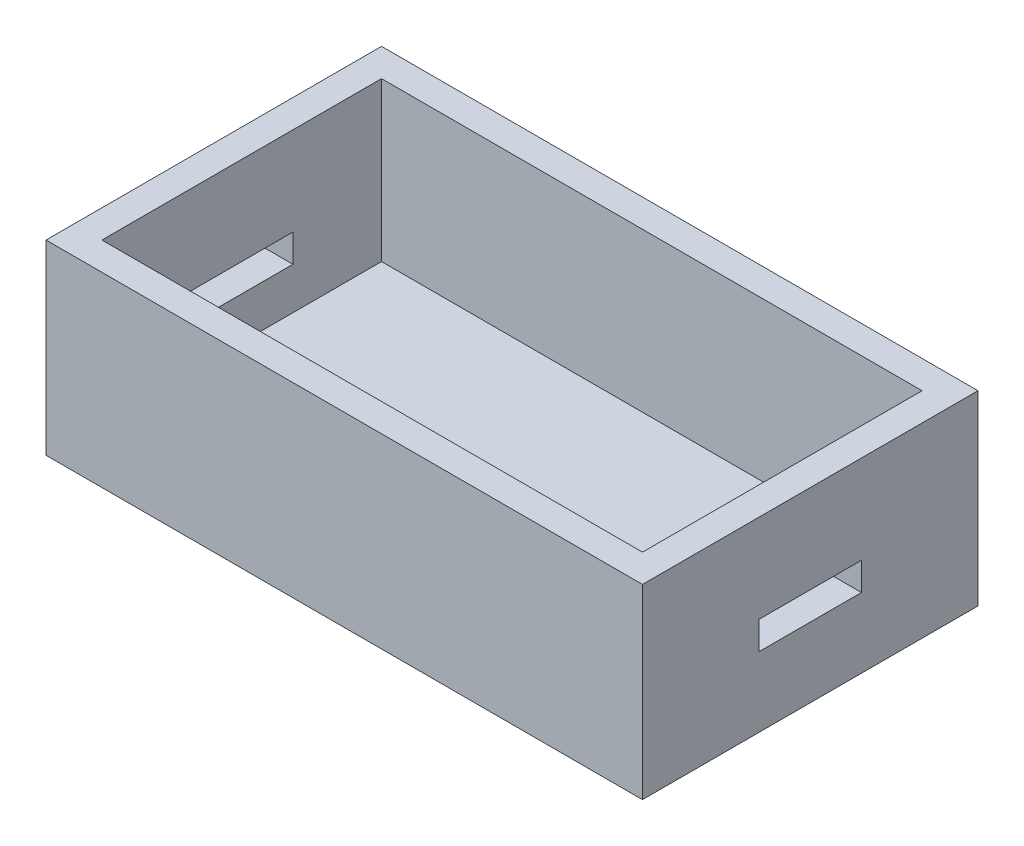
ISO-10303-21;
HEADER;
FILE_DESCRIPTION(('STEP AP214'),'2;1');
FILE_NAME('part.step','',(''),(''),'','','');
FILE_SCHEMA(('AUTOMOTIVE_DESIGN { 1 0 10303 214 1 1 1 1 }'));
ENDSEC;
DATA;
#1=APPLICATION_CONTEXT('core data for automotive mechanical design processes');
#2=APPLICATION_PROTOCOL_DEFINITION('international standard','automotive_design',2000,#1);
#3=PRODUCT_CONTEXT('',#1,'mechanical');
#4=PRODUCT('Part','Part','',(#3));
#5=PRODUCT_RELATED_PRODUCT_CATEGORY('part','',(#4));
#6=PRODUCT_DEFINITION_FORMATION('','',#4);
#7=PRODUCT_DEFINITION_CONTEXT('part definition',#1,'design');
#8=PRODUCT_DEFINITION('design','',#6,#7);
#9=PRODUCT_DEFINITION_SHAPE('','',#8);
#10=(LENGTH_UNIT() NAMED_UNIT(*) SI_UNIT(.MILLI.,.METRE.));
#11=(NAMED_UNIT(*) PLANE_ANGLE_UNIT() SI_UNIT($,.RADIAN.));
#12=(NAMED_UNIT(*) SI_UNIT($,.STERADIAN.) SOLID_ANGLE_UNIT());
#13=UNCERTAINTY_MEASURE_WITH_UNIT(LENGTH_MEASURE(1.E-05),#10,'distance_accuracy_value','');
#14=(GEOMETRIC_REPRESENTATION_CONTEXT(3) GLOBAL_UNCERTAINTY_ASSIGNED_CONTEXT((#13)) GLOBAL_UNIT_ASSIGNED_CONTEXT((#10,
#11,#12)) REPRESENTATION_CONTEXT('',''));
#15=CARTESIAN_POINT('',(0.,0.,0.));
#16=DIRECTION('',(0.,0.,1.));
#17=DIRECTION('',(1.,0.,0.));
#18=AXIS2_PLACEMENT_3D('',#15,#16,#17);
#19=CARTESIAN_POINT('',(0.,10.,0.));
#20=DIRECTION('',(0.,-1.,0.));
#21=DIRECTION('',(0.,0.,-1.));
#22=AXIS2_PLACEMENT_3D('',#19,#20,#21);
#23=PLANE('',#22);
#24=DIRECTION('',(0.,0.,-1.));
#25=VECTOR('',#24,1.);
#26=CARTESIAN_POINT('',(16.,10.,9.));
#27=LINE('',#26,#25);
#28=CARTESIAN_POINT('',(16.,10.,9.));
#29=VERTEX_POINT('',#28);
#30=CARTESIAN_POINT('',(16.,10.,-9.));
#31=VERTEX_POINT('',#30);
#32=EDGE_CURVE('E271',#29,#31,#27,.T.);
#33=ORIENTED_EDGE('',*,*,#32,.T.);
#34=DIRECTION('',(-1.,0.,0.));
#35=VECTOR('',#34,1.);
#36=CARTESIAN_POINT('',(-16.,10.,-9.));
#37=LINE('',#36,#35);
#38=CARTESIAN_POINT('',(-16.,10.,-9.));
#39=VERTEX_POINT('',#38);
#40=EDGE_CURVE('E276',#31,#39,#37,.T.);
#41=ORIENTED_EDGE('',*,*,#40,.T.);
#42=DIRECTION('',(0.,0.,1.));
#43=VECTOR('',#42,1.);
#44=CARTESIAN_POINT('',(-16.,10.,9.));
#45=LINE('',#44,#43);
#46=CARTESIAN_POINT('',(-16.,10.,9.));
#47=VERTEX_POINT('',#46);
#48=EDGE_CURVE('E281',#39,#47,#45,.T.);
#49=ORIENTED_EDGE('',*,*,#48,.T.);
#50=DIRECTION('',(1.,0.,0.));
#51=VECTOR('',#50,1.);
#52=CARTESIAN_POINT('',(-16.,10.,9.));
#53=LINE('',#52,#51);
#54=EDGE_CURVE('E282',#47,#29,#53,.T.);
#55=ORIENTED_EDGE('',*,*,#54,.T.);
#56=EDGE_LOOP('',(#33,#41,#49,#55));
#57=FACE_BOUND('',#56,.T.);
#58=DIRECTION('',(0.,0.,-1.));
#59=VECTOR('',#58,1.);
#60=CARTESIAN_POINT('',(14.5,10.,0.));
#61=LINE('',#60,#59);
#62=CARTESIAN_POINT('',(14.5,10.,7.5));
#63=VERTEX_POINT('',#62);
#64=CARTESIAN_POINT('',(14.5,10.,-7.5));
#65=VERTEX_POINT('',#64);
#66=EDGE_CURVE('E261',#63,#65,#61,.T.);
#67=ORIENTED_EDGE('',*,*,#66,.F.);
#68=DIRECTION('',(1.,0.,0.));
#69=VECTOR('',#68,1.);
#70=CARTESIAN_POINT('',(0.,10.,7.5));
#71=LINE('',#70,#69);
#72=CARTESIAN_POINT('',(-14.5,10.,7.5));
#73=VERTEX_POINT('',#72);
#74=EDGE_CURVE('E246',#73,#63,#71,.T.);
#75=ORIENTED_EDGE('',*,*,#74,.F.);
#76=DIRECTION('',(0.,0.,1.));
#77=VECTOR('',#76,1.);
#78=CARTESIAN_POINT('',(-14.5,10.,0.));
#79=LINE('',#78,#77);
#80=CARTESIAN_POINT('',(-14.5,10.,-7.5));
#81=VERTEX_POINT('',#80);
#82=EDGE_CURVE('E267',#81,#73,#79,.T.);
#83=ORIENTED_EDGE('',*,*,#82,.F.);
#84=DIRECTION('',(-1.,0.,0.));
#85=VECTOR('',#84,1.);
#86=CARTESIAN_POINT('',(0.,10.,-7.5));
#87=LINE('',#86,#85);
#88=EDGE_CURVE('E262',#65,#81,#87,.T.);
#89=ORIENTED_EDGE('',*,*,#88,.F.);
#90=EDGE_LOOP('',(#67,#75,#83,#89));
#91=FACE_BOUND('',#90,.T.);
#92=ADVANCED_FACE('F44',(#57,#91),#23,.F.);
#93=CARTESIAN_POINT('',(16.,10.,9.));
#94=DIRECTION('',(-1.,0.,0.));
#95=DIRECTION('',(0.,0.,1.));
#96=AXIS2_PLACEMENT_3D('',#93,#94,#95);
#97=PLANE('',#96);
#98=DIRECTION('',(0.,0.,1.));
#99=VECTOR('',#98,1.);
#100=CARTESIAN_POINT('',(16.,5.25,2.75));
#101=LINE('',#100,#99);
#102=CARTESIAN_POINT('',(16.,5.25,-2.75));
#103=VERTEX_POINT('',#102);
#104=CARTESIAN_POINT('',(16.,5.25,2.75));
#105=VERTEX_POINT('',#104);
#106=EDGE_CURVE('E197',#103,#105,#101,.T.);
#107=ORIENTED_EDGE('',*,*,#106,.F.);
#108=DIRECTION('',(0.,1.,0.));
#109=VECTOR('',#108,1.);
#110=CARTESIAN_POINT('',(16.,3.75,-2.75));
#111=LINE('',#110,#109);
#112=CARTESIAN_POINT('',(16.,3.75,-2.75));
#113=VERTEX_POINT('',#112);
#114=EDGE_CURVE('E64',#113,#103,#111,.T.);
#115=ORIENTED_EDGE('',*,*,#114,.F.);
#116=DIRECTION('',(0.,0.,-1.));
#117=VECTOR('',#116,1.);
#118=CARTESIAN_POINT('',(16.,3.75,2.75));
#119=LINE('',#118,#117);
#120=CARTESIAN_POINT('',(16.,3.75,2.75));
#121=VERTEX_POINT('',#120);
#122=EDGE_CURVE('E187',#121,#113,#119,.T.);
#123=ORIENTED_EDGE('',*,*,#122,.F.);
#124=DIRECTION('',(0.,-1.,0.));
#125=VECTOR('',#124,1.);
#126=CARTESIAN_POINT('',(16.,3.75,2.75));
#127=LINE('',#126,#125);
#128=EDGE_CURVE('E188',#105,#121,#127,.T.);
#129=ORIENTED_EDGE('',*,*,#128,.F.);
#130=EDGE_LOOP('',(#107,#115,#123,#129));
#131=FACE_BOUND('',#130,.T.);
#132=DIRECTION('',(0.,0.,-1.));
#133=VECTOR('',#132,1.);
#134=CARTESIAN_POINT('',(16.,0.,9.));
#135=LINE('',#134,#133);
#136=CARTESIAN_POINT('',(16.,0.,9.));
#137=VERTEX_POINT('',#136);
#138=CARTESIAN_POINT('',(16.,0.,-9.));
#139=VERTEX_POINT('',#138);
#140=EDGE_CURVE('E237',#137,#139,#135,.T.);
#141=ORIENTED_EDGE('',*,*,#140,.T.);
#142=DIRECTION('',(0.,-1.,0.));
#143=VECTOR('',#142,1.);
#144=CARTESIAN_POINT('',(16.,10.,-9.));
#145=LINE('',#144,#143);
#146=EDGE_CURVE('E309',#31,#139,#145,.T.);
#147=ORIENTED_EDGE('',*,*,#146,.F.);
#148=ORIENTED_EDGE('',*,*,#32,.F.);
#149=DIRECTION('',(0.,-1.,0.));
#150=VECTOR('',#149,1.);
#151=CARTESIAN_POINT('',(16.,10.,9.));
#152=LINE('',#151,#150);
#153=EDGE_CURVE('E287',#29,#137,#152,.T.);
#154=ORIENTED_EDGE('',*,*,#153,.T.);
#155=EDGE_LOOP('',(#141,#147,#148,#154));
#156=FACE_BOUND('',#155,.T.);
#157=ADVANCED_FACE('F50',(#131,#156),#97,.F.);
#158=CARTESIAN_POINT('',(-16.,10.,-9.));
#159=DIRECTION('',(0.,0.,1.));
#160=DIRECTION('',(1.,0.,0.));
#161=AXIS2_PLACEMENT_3D('',#158,#159,#160);
#162=PLANE('',#161);
#163=DIRECTION('',(-1.,0.,0.));
#164=VECTOR('',#163,1.);
#165=CARTESIAN_POINT('',(-16.,0.,-9.));
#166=LINE('',#165,#164);
#167=CARTESIAN_POINT('',(-16.,0.,-9.));
#168=VERTEX_POINT('',#167);
#169=EDGE_CURVE('E293',#139,#168,#166,.T.);
#170=ORIENTED_EDGE('',*,*,#169,.T.);
#171=DIRECTION('',(0.,-1.,0.));
#172=VECTOR('',#171,1.);
#173=CARTESIAN_POINT('',(-16.,10.,-9.));
#174=LINE('',#173,#172);
#175=EDGE_CURVE('E306',#39,#168,#174,.T.);
#176=ORIENTED_EDGE('',*,*,#175,.F.);
#177=ORIENTED_EDGE('',*,*,#40,.F.);
#178=ORIENTED_EDGE('',*,*,#146,.T.);
#179=EDGE_LOOP('',(#170,#176,#177,#178));
#180=FACE_BOUND('',#179,.T.);
#181=ADVANCED_FACE('F349',(#180),#162,.F.);
#182=CARTESIAN_POINT('',(-16.,10.,9.));
#183=DIRECTION('',(1.,0.,0.));
#184=DIRECTION('',(0.,0.,-1.));
#185=AXIS2_PLACEMENT_3D('',#182,#183,#184);
#186=PLANE('',#185);
#187=DIRECTION('',(0.,0.,-1.));
#188=VECTOR('',#187,1.);
#189=CARTESIAN_POINT('',(-16.,3.75,2.75));
#190=LINE('',#189,#188);
#191=CARTESIAN_POINT('',(-16.,3.75,2.75));
#192=VERTEX_POINT('',#191);
#193=CARTESIAN_POINT('',(-16.,3.75,-2.75));
#194=VERTEX_POINT('',#193);
#195=EDGE_CURVE('E183',#192,#194,#190,.T.);
#196=ORIENTED_EDGE('',*,*,#195,.T.);
#197=DIRECTION('',(0.,1.,0.));
#198=VECTOR('',#197,1.);
#199=CARTESIAN_POINT('',(-16.,3.75,-2.75));
#200=LINE('',#199,#198);
#201=CARTESIAN_POINT('',(-16.,5.25,-2.75));
#202=VERTEX_POINT('',#201);
#203=EDGE_CURVE('E164',#194,#202,#200,.T.);
#204=ORIENTED_EDGE('',*,*,#203,.T.);
#205=DIRECTION('',(0.,0.,1.));
#206=VECTOR('',#205,1.);
#207=CARTESIAN_POINT('',(-16.,5.25,2.75));
#208=LINE('',#207,#206);
#209=CARTESIAN_POINT('',(-16.,5.25,2.75));
#210=VERTEX_POINT('',#209);
#211=EDGE_CURVE('E174',#202,#210,#208,.T.);
#212=ORIENTED_EDGE('',*,*,#211,.T.);
#213=DIRECTION('',(0.,-1.,0.));
#214=VECTOR('',#213,1.);
#215=CARTESIAN_POINT('',(-16.,3.75,2.75));
#216=LINE('',#215,#214);
#217=EDGE_CURVE('E67',#210,#192,#216,.T.);
#218=ORIENTED_EDGE('',*,*,#217,.T.);
#219=EDGE_LOOP('',(#196,#204,#212,#218));
#220=FACE_BOUND('',#219,.T.);
#221=DIRECTION('',(0.,0.,1.));
#222=VECTOR('',#221,1.);
#223=CARTESIAN_POINT('',(-16.,0.,9.));
#224=LINE('',#223,#222);
#225=CARTESIAN_POINT('',(-16.,0.,9.));
#226=VERTEX_POINT('',#225);
#227=EDGE_CURVE('E295',#168,#226,#224,.T.);
#228=ORIENTED_EDGE('',*,*,#227,.T.);
#229=DIRECTION('',(0.,-1.,0.));
#230=VECTOR('',#229,1.);
#231=CARTESIAN_POINT('',(-16.,10.,9.));
#232=LINE('',#231,#230);
#233=EDGE_CURVE('E305',#47,#226,#232,.T.);
#234=ORIENTED_EDGE('',*,*,#233,.F.);
#235=ORIENTED_EDGE('',*,*,#48,.F.);
#236=ORIENTED_EDGE('',*,*,#175,.T.);
#237=EDGE_LOOP('',(#228,#234,#235,#236));
#238=FACE_BOUND('',#237,.T.);
#239=ADVANCED_FACE('F181',(#220,#238),#186,.F.);
#240=CARTESIAN_POINT('',(-16.,10.,9.));
#241=DIRECTION('',(0.,0.,-1.));
#242=DIRECTION('',(-1.,0.,0.));
#243=AXIS2_PLACEMENT_3D('',#240,#241,#242);
#244=PLANE('',#243);
#245=DIRECTION('',(1.,0.,0.));
#246=VECTOR('',#245,1.);
#247=CARTESIAN_POINT('',(-16.,0.,9.));
#248=LINE('',#247,#246);
#249=EDGE_CURVE('E280',#226,#137,#248,.T.);
#250=ORIENTED_EDGE('',*,*,#249,.T.);
#251=ORIENTED_EDGE('',*,*,#153,.F.);
#252=ORIENTED_EDGE('',*,*,#54,.F.);
#253=ORIENTED_EDGE('',*,*,#233,.T.);
#254=EDGE_LOOP('',(#250,#251,#252,#253));
#255=FACE_BOUND('',#254,.T.);
#256=ADVANCED_FACE('F360',(#255),#244,.F.);
#257=CARTESIAN_POINT('',(0.,0.,0.));
#258=DIRECTION('',(0.,-1.,0.));
#259=DIRECTION('',(0.,0.,-1.));
#260=AXIS2_PLACEMENT_3D('',#257,#258,#259);
#261=PLANE('',#260);
#262=ORIENTED_EDGE('',*,*,#140,.F.);
#263=ORIENTED_EDGE('',*,*,#249,.F.);
#264=ORIENTED_EDGE('',*,*,#227,.F.);
#265=ORIENTED_EDGE('',*,*,#169,.F.);
#266=EDGE_LOOP('',(#262,#263,#264,#265));
#267=FACE_BOUND('',#266,.T.);
#268=ADVANCED_FACE('F358',(#267),#261,.T.);
#269=CARTESIAN_POINT('',(14.5,10.,9.));
#270=DIRECTION('',(-1.,0.,0.));
#271=DIRECTION('',(0.,0.,1.));
#272=AXIS2_PLACEMENT_3D('',#269,#270,#271);
#273=PLANE('',#272);
#274=DIRECTION('',(0.,-1.,0.));
#275=VECTOR('',#274,1.);
#276=CARTESIAN_POINT('',(14.5,10.,-2.75));
#277=LINE('',#276,#275);
#278=CARTESIAN_POINT('',(14.5,5.25,-2.75));
#279=VERTEX_POINT('',#278);
#280=CARTESIAN_POINT('',(14.5,3.75,-2.75));
#281=VERTEX_POINT('',#280);
#282=EDGE_CURVE('E227',#279,#281,#277,.T.);
#283=ORIENTED_EDGE('',*,*,#282,.F.);
#284=DIRECTION('',(0.,0.,-1.));
#285=VECTOR('',#284,1.);
#286=CARTESIAN_POINT('',(14.5,5.25,9.));
#287=LINE('',#286,#285);
#288=CARTESIAN_POINT('',(14.5,5.25,2.75));
#289=VERTEX_POINT('',#288);
#290=EDGE_CURVE('E209',#289,#279,#287,.T.);
#291=ORIENTED_EDGE('',*,*,#290,.F.);
#292=DIRECTION('',(0.,1.,0.));
#293=VECTOR('',#292,1.);
#294=CARTESIAN_POINT('',(14.5,10.,2.75));
#295=LINE('',#294,#293);
#296=CARTESIAN_POINT('',(14.5,3.75,2.75));
#297=VERTEX_POINT('',#296);
#298=EDGE_CURVE('E219',#297,#289,#295,.T.);
#299=ORIENTED_EDGE('',*,*,#298,.F.);
#300=DIRECTION('',(0.,0.,1.));
#301=VECTOR('',#300,1.);
#302=CARTESIAN_POINT('',(14.5,3.75,9.));
#303=LINE('',#302,#301);
#304=EDGE_CURVE('E223',#281,#297,#303,.T.);
#305=ORIENTED_EDGE('',*,*,#304,.F.);
#306=EDGE_LOOP('',(#283,#291,#299,#305));
#307=FACE_BOUND('',#306,.T.);
#308=DIRECTION('',(0.,0.,-1.));
#309=VECTOR('',#308,1.);
#310=CARTESIAN_POINT('',(14.5,1.5,0.));
#311=LINE('',#310,#309);
#312=CARTESIAN_POINT('',(14.5,1.5,7.5));
#313=VERTEX_POINT('',#312);
#314=CARTESIAN_POINT('',(14.5,1.5,-7.5));
#315=VERTEX_POINT('',#314);
#316=EDGE_CURVE('E229',#313,#315,#311,.T.);
#317=ORIENTED_EDGE('',*,*,#316,.F.);
#318=DIRECTION('',(0.,-1.,0.));
#319=VECTOR('',#318,1.);
#320=CARTESIAN_POINT('',(14.5,10.,7.5));
#321=LINE('',#320,#319);
#322=EDGE_CURVE('E241',#63,#313,#321,.T.);
#323=ORIENTED_EDGE('',*,*,#322,.F.);
#324=ORIENTED_EDGE('',*,*,#66,.T.);
#325=DIRECTION('',(0.,-1.,0.));
#326=VECTOR('',#325,1.);
#327=CARTESIAN_POINT('',(14.5,10.,-7.5));
#328=LINE('',#327,#326);
#329=EDGE_CURVE('E232',#65,#315,#328,.T.);
#330=ORIENTED_EDGE('',*,*,#329,.T.);
#331=EDGE_LOOP('',(#317,#323,#324,#330));
#332=FACE_BOUND('',#331,.T.);
#333=ADVANCED_FACE('F356',(#307,#332),#273,.T.);
#334=CARTESIAN_POINT('',(-16.,10.,-7.5));
#335=DIRECTION('',(0.,0.,1.));
#336=DIRECTION('',(1.,0.,0.));
#337=AXIS2_PLACEMENT_3D('',#334,#335,#336);
#338=PLANE('',#337);
#339=DIRECTION('',(-1.,0.,0.));
#340=VECTOR('',#339,1.);
#341=CARTESIAN_POINT('',(0.,1.5,-7.5));
#342=LINE('',#341,#340);
#343=CARTESIAN_POINT('',(-14.5,1.5,-7.5));
#344=VERTEX_POINT('',#343);
#345=EDGE_CURVE('E234',#315,#344,#342,.T.);
#346=ORIENTED_EDGE('',*,*,#345,.F.);
#347=ORIENTED_EDGE('',*,*,#329,.F.);
#348=ORIENTED_EDGE('',*,*,#88,.T.);
#349=DIRECTION('',(0.,-1.,0.));
#350=VECTOR('',#349,1.);
#351=CARTESIAN_POINT('',(-14.5,10.,-7.5));
#352=LINE('',#351,#350);
#353=EDGE_CURVE('E239',#81,#344,#352,.T.);
#354=ORIENTED_EDGE('',*,*,#353,.T.);
#355=EDGE_LOOP('',(#346,#347,#348,#354));
#356=FACE_BOUND('',#355,.T.);
#357=ADVANCED_FACE('F409',(#356),#338,.T.);
#358=CARTESIAN_POINT('',(-14.5,10.,9.));
#359=DIRECTION('',(1.,0.,0.));
#360=DIRECTION('',(0.,0.,-1.));
#361=AXIS2_PLACEMENT_3D('',#358,#359,#360);
#362=PLANE('',#361);
#363=DIRECTION('',(0.,1.,0.));
#364=VECTOR('',#363,1.);
#365=CARTESIAN_POINT('',(-14.5,10.,-2.75));
#366=LINE('',#365,#364);
#367=CARTESIAN_POINT('',(-14.5,3.75,-2.75));
#368=VERTEX_POINT('',#367);
#369=CARTESIAN_POINT('',(-14.5,5.25,-2.75));
#370=VERTEX_POINT('',#369);
#371=EDGE_CURVE('E11',#368,#370,#366,.T.);
#372=ORIENTED_EDGE('',*,*,#371,.F.);
#373=DIRECTION('',(0.,0.,-1.));
#374=VECTOR('',#373,1.);
#375=CARTESIAN_POINT('',(-14.5,3.75,9.));
#376=LINE('',#375,#374);
#377=CARTESIAN_POINT('',(-14.5,3.75,2.75));
#378=VERTEX_POINT('',#377);
#379=EDGE_CURVE('E53',#378,#368,#376,.T.);
#380=ORIENTED_EDGE('',*,*,#379,.F.);
#381=DIRECTION('',(0.,-1.,0.));
#382=VECTOR('',#381,1.);
#383=CARTESIAN_POINT('',(-14.5,10.,2.75));
#384=LINE('',#383,#382);
#385=CARTESIAN_POINT('',(-14.5,5.25,2.75));
#386=VERTEX_POINT('',#385);
#387=EDGE_CURVE('E320',#386,#378,#384,.T.);
#388=ORIENTED_EDGE('',*,*,#387,.F.);
#389=DIRECTION('',(0.,0.,1.));
#390=VECTOR('',#389,1.);
#391=CARTESIAN_POINT('',(-14.5,5.25,9.));
#392=LINE('',#391,#390);
#393=EDGE_CURVE('E313',#370,#386,#392,.T.);
#394=ORIENTED_EDGE('',*,*,#393,.F.);
#395=EDGE_LOOP('',(#372,#380,#388,#394));
#396=FACE_BOUND('',#395,.T.);
#397=DIRECTION('',(0.,0.,1.));
#398=VECTOR('',#397,1.);
#399=CARTESIAN_POINT('',(-14.5,1.5,0.));
#400=LINE('',#399,#398);
#401=CARTESIAN_POINT('',(-14.5,1.5,7.5));
#402=VERTEX_POINT('',#401);
#403=EDGE_CURVE('E248',#344,#402,#400,.T.);
#404=ORIENTED_EDGE('',*,*,#403,.F.);
#405=ORIENTED_EDGE('',*,*,#353,.F.);
#406=ORIENTED_EDGE('',*,*,#82,.T.);
#407=DIRECTION('',(0.,-1.,0.));
#408=VECTOR('',#407,1.);
#409=CARTESIAN_POINT('',(-14.5,10.,7.5));
#410=LINE('',#409,#408);
#411=EDGE_CURVE('E244',#73,#402,#410,.T.);
#412=ORIENTED_EDGE('',*,*,#411,.T.);
#413=EDGE_LOOP('',(#404,#405,#406,#412));
#414=FACE_BOUND('',#413,.T.);
#415=ADVANCED_FACE('F322',(#396,#414),#362,.T.);
#416=CARTESIAN_POINT('',(-16.,10.,7.5));
#417=DIRECTION('',(0.,0.,-1.));
#418=DIRECTION('',(-1.,0.,0.));
#419=AXIS2_PLACEMENT_3D('',#416,#417,#418);
#420=PLANE('',#419);
#421=DIRECTION('',(1.,0.,0.));
#422=VECTOR('',#421,1.);
#423=CARTESIAN_POINT('',(0.,1.5,7.5));
#424=LINE('',#423,#422);
#425=EDGE_CURVE('E253',#402,#313,#424,.T.);
#426=ORIENTED_EDGE('',*,*,#425,.F.);
#427=ORIENTED_EDGE('',*,*,#411,.F.);
#428=ORIENTED_EDGE('',*,*,#74,.T.);
#429=ORIENTED_EDGE('',*,*,#322,.T.);
#430=EDGE_LOOP('',(#426,#427,#428,#429));
#431=FACE_BOUND('',#430,.T.);
#432=ADVANCED_FACE('F424',(#431),#420,.T.);
#433=CARTESIAN_POINT('',(0.,1.5,0.));
#434=DIRECTION('',(0.,-1.,0.));
#435=DIRECTION('',(0.,0.,-1.));
#436=AXIS2_PLACEMENT_3D('',#433,#434,#435);
#437=PLANE('',#436);
#438=ORIENTED_EDGE('',*,*,#316,.T.);
#439=ORIENTED_EDGE('',*,*,#345,.T.);
#440=ORIENTED_EDGE('',*,*,#403,.T.);
#441=ORIENTED_EDGE('',*,*,#425,.T.);
#442=EDGE_LOOP('',(#438,#439,#440,#441));
#443=FACE_BOUND('',#442,.T.);
#444=ADVANCED_FACE('F340',(#443),#437,.F.);
#445=CARTESIAN_POINT('',(-16.,5.25,2.75));
#446=DIRECTION('',(0.,1.,0.));
#447=DIRECTION('',(0.,0.,1.));
#448=AXIS2_PLACEMENT_3D('',#445,#446,#447);
#449=PLANE('',#448);
#450=ORIENTED_EDGE('',*,*,#393,.T.);
#451=DIRECTION('',(1.,0.,0.));
#452=VECTOR('',#451,1.);
#453=CARTESIAN_POINT('',(-16.,5.25,2.75));
#454=LINE('',#453,#452);
#455=EDGE_CURVE('E180',#210,#386,#454,.T.);
#456=ORIENTED_EDGE('',*,*,#455,.F.);
#457=ORIENTED_EDGE('',*,*,#211,.F.);
#458=DIRECTION('',(1.,0.,0.));
#459=VECTOR('',#458,1.);
#460=CARTESIAN_POINT('',(-16.,5.25,-2.75));
#461=LINE('',#460,#459);
#462=EDGE_CURVE('E160',#202,#370,#461,.T.);
#463=ORIENTED_EDGE('',*,*,#462,.T.);
#464=EDGE_LOOP('',(#450,#456,#457,#463));
#465=FACE_BOUND('',#464,.T.);
#466=ADVANCED_FACE('F176',(#465),#449,.F.);
#467=CARTESIAN_POINT('',(-16.,3.75,2.75));
#468=DIRECTION('',(0.,0.,1.));
#469=DIRECTION('',(1.,0.,0.));
#470=AXIS2_PLACEMENT_3D('',#467,#468,#469);
#471=PLANE('',#470);
#472=ORIENTED_EDGE('',*,*,#387,.T.);
#473=DIRECTION('',(1.,0.,0.));
#474=VECTOR('',#473,1.);
#475=CARTESIAN_POINT('',(-16.,3.75,2.75));
#476=LINE('',#475,#474);
#477=EDGE_CURVE('E214',#192,#378,#476,.T.);
#478=ORIENTED_EDGE('',*,*,#477,.F.);
#479=ORIENTED_EDGE('',*,*,#217,.F.);
#480=ORIENTED_EDGE('',*,*,#455,.T.);
#481=EDGE_LOOP('',(#472,#478,#479,#480));
#482=FACE_BOUND('',#481,.T.);
#483=ADVANCED_FACE('F330',(#482),#471,.F.);
#484=CARTESIAN_POINT('',(-16.,3.75,2.75));
#485=DIRECTION('',(0.,-1.,0.));
#486=DIRECTION('',(0.,0.,-1.));
#487=AXIS2_PLACEMENT_3D('',#484,#485,#486);
#488=PLANE('',#487);
#489=ORIENTED_EDGE('',*,*,#379,.T.);
#490=DIRECTION('',(1.,0.,0.));
#491=VECTOR('',#490,1.);
#492=CARTESIAN_POINT('',(-16.,3.75,-2.75));
#493=LINE('',#492,#491);
#494=EDGE_CURVE('E207',#194,#368,#493,.T.);
#495=ORIENTED_EDGE('',*,*,#494,.F.);
#496=ORIENTED_EDGE('',*,*,#195,.F.);
#497=ORIENTED_EDGE('',*,*,#477,.T.);
#498=EDGE_LOOP('',(#489,#495,#496,#497));
#499=FACE_BOUND('',#498,.T.);
#500=ADVANCED_FACE('F321',(#499),#488,.F.);
#501=CARTESIAN_POINT('',(-16.,3.75,-2.75));
#502=DIRECTION('',(0.,0.,-1.));
#503=DIRECTION('',(-1.,0.,0.));
#504=AXIS2_PLACEMENT_3D('',#501,#502,#503);
#505=PLANE('',#504);
#506=ORIENTED_EDGE('',*,*,#371,.T.);
#507=ORIENTED_EDGE('',*,*,#462,.F.);
#508=ORIENTED_EDGE('',*,*,#203,.F.);
#509=ORIENTED_EDGE('',*,*,#494,.T.);
#510=EDGE_LOOP('',(#506,#507,#508,#509));
#511=FACE_BOUND('',#510,.T.);
#512=ADVANCED_FACE('F162',(#511),#505,.F.);
#513=ORIENTED_EDGE('',*,*,#282,.T.);
#514=EDGE_CURVE('E208',#281,#113,#493,.T.);
#515=ORIENTED_EDGE('',*,*,#514,.T.);
#516=ORIENTED_EDGE('',*,*,#114,.T.);
#517=EDGE_CURVE('E175',#279,#103,#461,.T.);
#518=ORIENTED_EDGE('',*,*,#517,.F.);
#519=EDGE_LOOP('',(#513,#515,#516,#518));
#520=FACE_BOUND('',#519,.T.);
#521=ADVANCED_FACE('F465',(#520),#505,.F.);
#522=ORIENTED_EDGE('',*,*,#304,.T.);
#523=EDGE_CURVE('E212',#297,#121,#476,.T.);
#524=ORIENTED_EDGE('',*,*,#523,.T.);
#525=ORIENTED_EDGE('',*,*,#122,.T.);
#526=ORIENTED_EDGE('',*,*,#514,.F.);
#527=EDGE_LOOP('',(#522,#524,#525,#526));
#528=FACE_BOUND('',#527,.T.);
#529=ADVANCED_FACE('F337',(#528),#488,.F.);
#530=ORIENTED_EDGE('',*,*,#298,.T.);
#531=EDGE_CURVE('E171',#289,#105,#454,.T.);
#532=ORIENTED_EDGE('',*,*,#531,.T.);
#533=ORIENTED_EDGE('',*,*,#128,.T.);
#534=ORIENTED_EDGE('',*,*,#523,.F.);
#535=EDGE_LOOP('',(#530,#532,#533,#534));
#536=FACE_BOUND('',#535,.T.);
#537=ADVANCED_FACE('F329',(#536),#471,.F.);
#538=ORIENTED_EDGE('',*,*,#290,.T.);
#539=ORIENTED_EDGE('',*,*,#517,.T.);
#540=ORIENTED_EDGE('',*,*,#106,.T.);
#541=ORIENTED_EDGE('',*,*,#531,.F.);
#542=EDGE_LOOP('',(#538,#539,#540,#541));
#543=FACE_BOUND('',#542,.T.);
#544=ADVANCED_FACE('F339',(#543),#449,.F.);
#545=CLOSED_SHELL('',(#92,#157,#181,#239,#256,#268,#333,#357,#415,#432,#444,#466,#483,#500,#512,
#521,#529,#537,#544));
#546=MANIFOLD_SOLID_BREP('B2',#545);
#547=ADVANCED_BREP_SHAPE_REPRESENTATION('',(#18,#546),#14);
#548=SHAPE_DEFINITION_REPRESENTATION(#9,#547);
ENDSEC;
END-ISO-10303-21;
